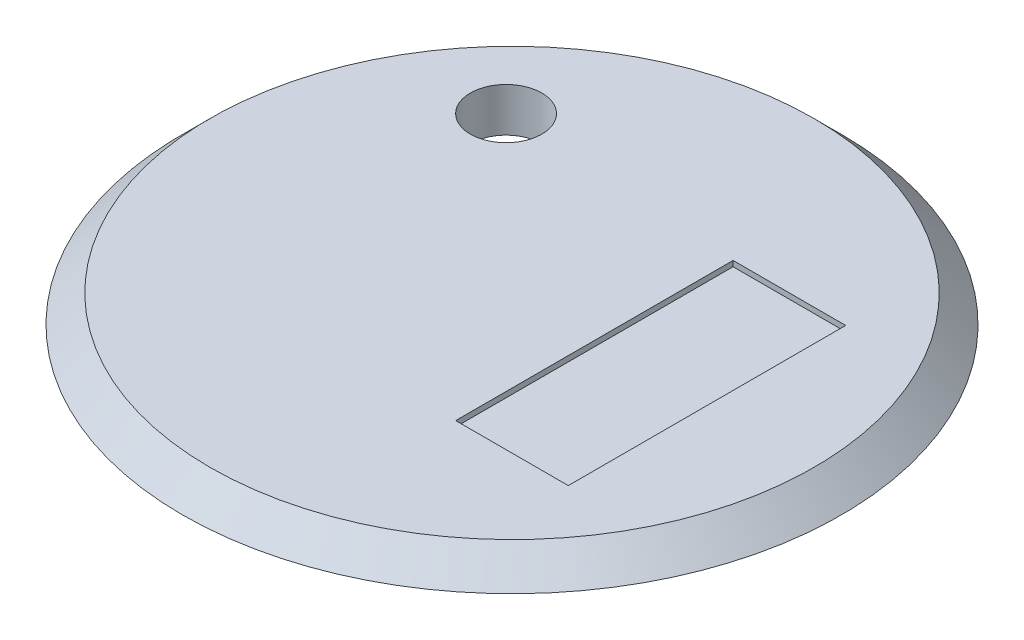
ISO-10303-21;
HEADER;
FILE_DESCRIPTION(('STEP AP214'),'2;1');
FILE_NAME('part.step','',(''),(''),'','','');
FILE_SCHEMA(('AUTOMOTIVE_DESIGN { 1 0 10303 214 1 1 1 1 }'));
ENDSEC;
DATA;
#1=APPLICATION_CONTEXT('core data for automotive mechanical design processes');
#2=APPLICATION_PROTOCOL_DEFINITION('international standard','automotive_design',2000,#1);
#3=PRODUCT_CONTEXT('',#1,'mechanical');
#4=PRODUCT('Part','Part','',(#3));
#5=PRODUCT_RELATED_PRODUCT_CATEGORY('part','',(#4));
#6=PRODUCT_DEFINITION_FORMATION('','',#4);
#7=PRODUCT_DEFINITION_CONTEXT('part definition',#1,'design');
#8=PRODUCT_DEFINITION('design','',#6,#7);
#9=PRODUCT_DEFINITION_SHAPE('','',#8);
#10=(LENGTH_UNIT() NAMED_UNIT(*) SI_UNIT(.MILLI.,.METRE.));
#11=(NAMED_UNIT(*) PLANE_ANGLE_UNIT() SI_UNIT($,.RADIAN.));
#12=(NAMED_UNIT(*) SI_UNIT($,.STERADIAN.) SOLID_ANGLE_UNIT());
#13=UNCERTAINTY_MEASURE_WITH_UNIT(LENGTH_MEASURE(1.E-05),#10,'distance_accuracy_value','');
#14=(GEOMETRIC_REPRESENTATION_CONTEXT(3) GLOBAL_UNCERTAINTY_ASSIGNED_CONTEXT((#13)) GLOBAL_UNIT_ASSIGNED_CONTEXT((#10,
#11,#12)) REPRESENTATION_CONTEXT('',''));
#15=CARTESIAN_POINT('',(0.,0.,0.));
#16=DIRECTION('',(0.,0.,1.));
#17=DIRECTION('',(1.,0.,0.));
#18=AXIS2_PLACEMENT_3D('',#15,#16,#17);
#19=CARTESIAN_POINT('',(0.,1.97,1.02348682681033E-13));
#20=DIRECTION('',(0.,1.,0.));
#21=DIRECTION('',(0.999926888300994,0.,-0.0120920656917045));
#22=AXIS2_PLACEMENT_3D('',#19,#20,#21);
#23=CYLINDRICAL_SURFACE('',#22,2.8325);
#24=CARTESIAN_POINT('',(0.,3.,1.02348685082632E-13));
#25=DIRECTION('',(0.,1.,0.));
#26=DIRECTION('',(0.999926888300994,0.,-0.0120920656917045));
#27=AXIS2_PLACEMENT_3D('',#24,#25,#26);
#28=CIRCLE('',#27,2.8325);
#29=CARTESIAN_POINT('',(2.83229291111252,3.,-0.0342507760716505));
#30=VERTEX_POINT('',#29);
#31=EDGE_CURVE('E245',#30,#30,#28,.T.);
#32=ORIENTED_EDGE('',*,*,#31,.F.);
#33=EDGE_LOOP('',(#32));
#34=FACE_BOUND('',#33,.T.);
#35=CARTESIAN_POINT('',(0.,2.97,1.02348682681033E-13));
#36=DIRECTION('',(0.,-1.,0.));
#37=DIRECTION('',(0.,0.,-1.));
#38=AXIS2_PLACEMENT_3D('',#35,#36,#37);
#39=CIRCLE('',#38,2.83250000000002);
#40=CARTESIAN_POINT('',(0.,2.97,-2.83249999999991));
#41=VERTEX_POINT('',#40);
#42=EDGE_CURVE('E236',#41,#41,#39,.T.);
#43=ORIENTED_EDGE('',*,*,#42,.F.);
#44=EDGE_LOOP('',(#43));
#45=FACE_BOUND('',#44,.T.);
#46=ADVANCED_FACE('F49',(#34,#45),#23,.T.);
#47=CARTESIAN_POINT('',(0.,-3.,0.));
#48=DIRECTION('',(0.,-1.,0.));
#49=DIRECTION('',(0.,0.,-1.));
#50=AXIS2_PLACEMENT_3D('',#47,#48,#49);
#51=PLANE('',#50);
#52=CARTESIAN_POINT('',(-28.8179520298445,-3.,-27.740325174835));
#53=DIRECTION('',(0.,-1.,0.));
#54=DIRECTION('',(0.,0.,-1.));
#55=AXIS2_PLACEMENT_3D('',#52,#53,#54);
#56=CIRCLE('',#55,6.5);
#57=CARTESIAN_POINT('',(-28.8179520298445,-3.,-34.240325174835));
#58=VERTEX_POINT('',#57);
#59=EDGE_CURVE('E217',#58,#58,#56,.T.);
#60=ORIENTED_EDGE('',*,*,#59,.F.);
#61=EDGE_LOOP('',(#60));
#62=FACE_BOUND('',#61,.T.);
#63=DIRECTION('',(-0.993415905480513,0.,-0.114563688568114));
#64=VECTOR('',#63,1.);
#65=CARTESIAN_POINT('',(-0.674538719980193,-3.,5.84912638259182));
#66=LINE('',#65,#64);
#67=CARTESIAN_POINT('',(-8.11561340448885,-3.,4.99099943086379));
#68=VERTEX_POINT('',#67);
#69=CARTESIAN_POINT('',(-24.4631082554801,-3.,3.10575751089279));
#70=VERTEX_POINT('',#69);
#71=EDGE_CURVE('E11',#68,#70,#66,.T.);
#72=ORIENTED_EDGE('',*,*,#71,.F.);
#73=CARTESIAN_POINT('',(0.,-3.,1.02348671092735E-13));
#74=DIRECTION('',(0.,-1.,0.));
#75=DIRECTION('',(0.,0.,-1.));
#76=AXIS2_PLACEMENT_3D('',#73,#74,#75);
#77=CIRCLE('',#76,9.5275);
#78=CARTESIAN_POINT('',(-4.79328517116161,-3.,8.23393426728222));
#79=VERTEX_POINT('',#78);
#80=EDGE_CURVE('E59',#68,#79,#77,.F.);
#81=ORIENTED_EDGE('',*,*,#80,.T.);
#82=DIRECTION('',(-0.138553330284402,0.,-0.990354974070965));
#83=VECTOR('',#82,1.);
#84=CARTESIAN_POINT('',(-5.83110394650622,-3.,0.815787159327242));
#85=LINE('',#84,#83);
#86=CARTESIAN_POINT('',(-2.513273505437,-3.,24.5310589156415));
#87=VERTEX_POINT('',#86);
#88=EDGE_CURVE('E437',#87,#79,#85,.T.);
#89=ORIENTED_EDGE('',*,*,#88,.F.);
#90=CARTESIAN_POINT('',(0.291906958619007,-3.,24.1386066076109));
#91=DIRECTION('',(0.,-1.,0.));
#92=DIRECTION('',(0.,0.,-1.));
#93=AXIS2_PLACEMENT_3D('',#90,#91,#92);
#94=CIRCLE('',#93,2.8325);
#95=CARTESIAN_POINT('',(3.10575751089256,-3.,24.4631082554801));
#96=VERTEX_POINT('',#95);
#97=EDGE_CURVE('E434',#96,#87,#94,.T.);
#98=ORIENTED_EDGE('',*,*,#97,.F.);
#99=DIRECTION('',(-0.114563688568118,0.,0.993415905480513));
#100=VECTOR('',#99,1.);
#101=CARTESIAN_POINT('',(5.84912638259167,-3.,0.674538719980198));
#102=LINE('',#101,#100);
#103=CARTESIAN_POINT('',(4.99099943086361,-3.,8.11561340448893));
#104=VERTEX_POINT('',#103);
#105=EDGE_CURVE('E431',#104,#96,#102,.T.);
#106=ORIENTED_EDGE('',*,*,#105,.F.);
#107=CARTESIAN_POINT('',(0.,-3.,1.02348671092735E-13));
#108=DIRECTION('',(0.,-1.,0.));
#109=DIRECTION('',(0.,0.,-1.));
#110=AXIS2_PLACEMENT_3D('',#107,#108,#109);
#111=CIRCLE('',#110,9.5275);
#112=CARTESIAN_POINT('',(8.23393426728209,-3.,4.79328517116164));
#113=VERTEX_POINT('',#112);
#114=EDGE_CURVE('E424',#104,#113,#111,.F.);
#115=ORIENTED_EDGE('',*,*,#114,.T.);
#116=DIRECTION('',(-0.990354974070964,0.,0.138553330284406));
#117=VECTOR('',#116,1.);
#118=CARTESIAN_POINT('',(0.815787159327267,-3.,5.83110394650625));
#119=LINE('',#118,#117);
#120=CARTESIAN_POINT('',(24.5310589156414,-3.,2.51327350543697));
#121=VERTEX_POINT('',#120);
#122=EDGE_CURVE('E421',#121,#113,#119,.T.);
#123=ORIENTED_EDGE('',*,*,#122,.F.);
#124=CARTESIAN_POINT('',(24.1386066076108,-3.,-0.291906958619036));
#125=DIRECTION('',(0.,-1.,0.));
#126=DIRECTION('',(0.,0.,-1.));
#127=AXIS2_PLACEMENT_3D('',#124,#125,#126);
#128=CIRCLE('',#127,2.8325);
#129=CARTESIAN_POINT('',(24.46310825548,-3.,-3.10575751089259));
#130=VERTEX_POINT('',#129);
#131=EDGE_CURVE('E418',#130,#121,#128,.T.);
#132=ORIENTED_EDGE('',*,*,#131,.F.);
#133=DIRECTION('',(0.993415905480513,0.,0.114563688568114));
#134=VECTOR('',#133,1.);
#135=CARTESIAN_POINT('',(0.674538719980169,-3.,-5.8491263825916));
#136=LINE('',#135,#134);
#137=CARTESIAN_POINT('',(8.11561340448876,-3.,-4.99099943086358));
#138=VERTEX_POINT('',#137);
#139=EDGE_CURVE('E415',#138,#130,#136,.T.);
#140=ORIENTED_EDGE('',*,*,#139,.F.);
#141=CARTESIAN_POINT('',(0.,-3.,1.02348671092735E-13));
#142=DIRECTION('',(0.,-1.,0.));
#143=DIRECTION('',(0.,0.,-1.));
#144=AXIS2_PLACEMENT_3D('',#141,#142,#143);
#145=CIRCLE('',#144,9.5275);
#146=CARTESIAN_POINT('',(4.79328517116157,-3.,-8.23393426728198));
#147=VERTEX_POINT('',#146);
#148=EDGE_CURVE('E408',#138,#147,#145,.F.);
#149=ORIENTED_EDGE('',*,*,#148,.T.);
#150=DIRECTION('',(0.138553330284395,0.,0.990354974070966));
#151=VECTOR('',#150,1.);
#152=CARTESIAN_POINT('',(5.8311039465061,-3.,-0.815787159327184));
#153=LINE('',#152,#151);
#154=CARTESIAN_POINT('',(2.51327350543708,-3.,-24.5310589156413));
#155=VERTEX_POINT('',#154);
#156=EDGE_CURVE('E401',#155,#147,#153,.T.);
#157=ORIENTED_EDGE('',*,*,#156,.F.);
#158=CARTESIAN_POINT('',(-0.291906958618932,-3.,-24.1386066076107));
#159=DIRECTION('',(0.,-1.,0.));
#160=DIRECTION('',(0.,0.,-1.));
#161=AXIS2_PLACEMENT_3D('',#158,#159,#160);
#162=CIRCLE('',#161,2.8325);
#163=CARTESIAN_POINT('',(-3.10575751089248,-3.,-24.46310825548));
#164=VERTEX_POINT('',#163);
#165=EDGE_CURVE('E398',#164,#155,#162,.T.);
#166=ORIENTED_EDGE('',*,*,#165,.F.);
#167=DIRECTION('',(0.114563688568125,0.,-0.993415905480512));
#168=VECTOR('',#167,1.);
#169=CARTESIAN_POINT('',(-5.84912638259174,-3.,-0.674538719980246));
#170=LINE('',#169,#168);
#171=CARTESIAN_POINT('',(-4.99099943086365,-3.,-8.11561340448876));
#172=VERTEX_POINT('',#171);
#173=EDGE_CURVE('E395',#172,#164,#170,.T.);
#174=ORIENTED_EDGE('',*,*,#173,.F.);
#175=CARTESIAN_POINT('',(0.,-3.,1.02348671092735E-13));
#176=DIRECTION('',(0.,-1.,0.));
#177=DIRECTION('',(0.,0.,-1.));
#178=AXIS2_PLACEMENT_3D('',#175,#176,#177);
#179=CIRCLE('',#178,9.5275);
#180=CARTESIAN_POINT('',(-8.23393426728218,-3.,-4.79328517116143));
#181=VERTEX_POINT('',#180);
#182=EDGE_CURVE('E404',#172,#181,#179,.F.);
#183=ORIENTED_EDGE('',*,*,#182,.T.);
#184=DIRECTION('',(0.990354974070964,0.,-0.138553330284406));
#185=VECTOR('',#184,1.);
#186=CARTESIAN_POINT('',(-0.815787159327241,-3.,-5.83110394650606));
#187=LINE('',#186,#185);
#188=CARTESIAN_POINT('',(-24.5310589156415,-3.,-2.51327350543676));
#189=VERTEX_POINT('',#188);
#190=EDGE_CURVE('E412',#189,#181,#187,.T.);
#191=ORIENTED_EDGE('',*,*,#190,.F.);
#192=CARTESIAN_POINT('',(-24.1386066076109,-3.,0.29190695861924));
#193=DIRECTION('',(0.,-1.,0.));
#194=DIRECTION('',(0.,0.,-1.));
#195=AXIS2_PLACEMENT_3D('',#192,#193,#194);
#196=CIRCLE('',#195,2.8325);
#197=EDGE_CURVE('E428',#70,#189,#196,.T.);
#198=ORIENTED_EDGE('',*,*,#197,.F.);
#199=EDGE_LOOP('',(#72,#81,#89,#98,#106,#115,#123,#132,#140,#149,#157,#166,#174,#183,#191,#198));
#200=FACE_BOUND('',#199,.T.);
#201=CARTESIAN_POINT('',(0.,-3.,0.));
#202=DIRECTION('',(0.,-1.,0.));
#203=DIRECTION('',(0.,0.,-1.));
#204=AXIS2_PLACEMENT_3D('',#201,#202,#203);
#205=CIRCLE('',#204,49.5);
#206=CARTESIAN_POINT('',(0.,-3.,-49.5));
#207=VERTEX_POINT('',#206);
#208=EDGE_CURVE('E379',#207,#207,#205,.T.);
#209=ORIENTED_EDGE('',*,*,#208,.T.);
#210=EDGE_LOOP('',(#209));
#211=FACE_BOUND('',#210,.T.);
#212=ADVANCED_FACE('F444',(#62,#200,#211),#51,.T.);
#213=CARTESIAN_POINT('',(0.,5.,0.));
#214=DIRECTION('',(0.,1.,0.));
#215=DIRECTION('',(0.,0.,1.));
#216=AXIS2_PLACEMENT_3D('',#213,#214,#215);
#217=PLANE('',#216);
#218=CARTESIAN_POINT('',(-28.8179520298445,5.,-27.740325174835));
#219=DIRECTION('',(0.,-1.,0.));
#220=DIRECTION('',(0.,0.,-1.));
#221=AXIS2_PLACEMENT_3D('',#218,#219,#220);
#222=CIRCLE('',#221,6.5);
#223=CARTESIAN_POINT('',(-28.8179520298445,5.,-34.240325174835));
#224=VERTEX_POINT('',#223);
#225=EDGE_CURVE('E227',#224,#224,#222,.T.);
#226=ORIENTED_EDGE('',*,*,#225,.T.);
#227=EDGE_LOOP('',(#226));
#228=FACE_BOUND('',#227,.T.);
#229=DIRECTION('',(-1.,0.,0.));
#230=VECTOR('',#229,1.);
#231=CARTESIAN_POINT('',(35.5,5.,-25.25));
#232=LINE('',#231,#230);
#233=CARTESIAN_POINT('',(35.5,5.,-25.25));
#234=VERTEX_POINT('',#233);
#235=CARTESIAN_POINT('',(15.,5.,-25.25));
#236=VERTEX_POINT('',#235);
#237=EDGE_CURVE('E66',#234,#236,#232,.T.);
#238=ORIENTED_EDGE('',*,*,#237,.F.);
#239=DIRECTION('',(0.,0.,-1.));
#240=VECTOR('',#239,1.);
#241=CARTESIAN_POINT('',(35.5,5.,25.25));
#242=LINE('',#241,#240);
#243=CARTESIAN_POINT('',(35.5,5.,25.25));
#244=VERTEX_POINT('',#243);
#245=EDGE_CURVE('E210',#244,#234,#242,.T.);
#246=ORIENTED_EDGE('',*,*,#245,.F.);
#247=DIRECTION('',(1.,0.,0.));
#248=VECTOR('',#247,1.);
#249=CARTESIAN_POINT('',(15.,5.,25.25));
#250=LINE('',#249,#248);
#251=CARTESIAN_POINT('',(15.,5.,25.25));
#252=VERTEX_POINT('',#251);
#253=EDGE_CURVE('E214',#252,#244,#250,.T.);
#254=ORIENTED_EDGE('',*,*,#253,.F.);
#255=DIRECTION('',(0.,0.,1.));
#256=VECTOR('',#255,1.);
#257=CARTESIAN_POINT('',(15.,5.,-25.25));
#258=LINE('',#257,#256);
#259=EDGE_CURVE('E226',#236,#252,#258,.T.);
#260=ORIENTED_EDGE('',*,*,#259,.F.);
#261=EDGE_LOOP('',(#238,#246,#254,#260));
#262=FACE_BOUND('',#261,.T.);
#263=CARTESIAN_POINT('',(0.,5.,0.));
#264=DIRECTION('',(0.,1.,0.));
#265=DIRECTION('',(0.,0.,1.));
#266=AXIS2_PLACEMENT_3D('',#263,#264,#265);
#267=CIRCLE('',#266,55.0000000000001);
#268=CARTESIAN_POINT('',(0.,5.,55.0000000000001));
#269=VERTEX_POINT('',#268);
#270=EDGE_CURVE('E388',#269,#269,#267,.T.);
#271=ORIENTED_EDGE('',*,*,#270,.T.);
#272=EDGE_LOOP('',(#271));
#273=FACE_BOUND('',#272,.T.);
#274=ADVANCED_FACE('F522',(#228,#262,#273),#217,.T.);
#275=CARTESIAN_POINT('',(0.,0.,0.));
#276=DIRECTION('',(0.,1.,0.));
#277=DIRECTION('',(0.,0.,1.));
#278=AXIS2_PLACEMENT_3D('',#275,#276,#277);
#279=PLANE('',#278);
#280=CARTESIAN_POINT('',(0.,0.,0.));
#281=DIRECTION('',(0.,-1.,0.));
#282=DIRECTION('',(0.,0.,-1.));
#283=AXIS2_PLACEMENT_3D('',#280,#281,#282);
#284=CIRCLE('',#283,49.5);
#285=CARTESIAN_POINT('',(0.,0.,-49.5));
#286=VERTEX_POINT('',#285);
#287=EDGE_CURVE('E384',#286,#286,#284,.T.);
#288=ORIENTED_EDGE('',*,*,#287,.F.);
#289=EDGE_LOOP('',(#288));
#290=FACE_BOUND('',#289,.T.);
#291=CARTESIAN_POINT('',(0.,0.,0.));
#292=DIRECTION('',(0.,1.,0.));
#293=DIRECTION('',(0.,0.,1.));
#294=AXIS2_PLACEMENT_3D('',#291,#292,#293);
#295=CIRCLE('',#294,60.);
#296=CARTESIAN_POINT('',(0.,0.,60.));
#297=VERTEX_POINT('',#296);
#298=EDGE_CURVE('E383',#297,#297,#295,.T.);
#299=ORIENTED_EDGE('',*,*,#298,.F.);
#300=EDGE_LOOP('',(#299));
#301=FACE_BOUND('',#300,.T.);
#302=ADVANCED_FACE('F560',(#290,#301),#279,.F.);
#303=CARTESIAN_POINT('',(0.,-3.,0.));
#304=DIRECTION('',(0.,1.,0.));
#305=DIRECTION('',(0.,0.,1.));
#306=AXIS2_PLACEMENT_3D('',#303,#304,#305);
#307=CYLINDRICAL_SURFACE('',#306,49.5);
#308=ORIENTED_EDGE('',*,*,#208,.F.);
#309=EDGE_LOOP('',(#308));
#310=FACE_BOUND('',#309,.T.);
#311=ORIENTED_EDGE('',*,*,#287,.T.);
#312=EDGE_LOOP('',(#311));
#313=FACE_BOUND('',#312,.T.);
#314=ADVANCED_FACE('F557',(#310,#313),#307,.T.);
#315=CARTESIAN_POINT('',(0.,5.,0.));
#316=DIRECTION('',(0.,-1.,0.));
#317=DIRECTION('',(0.,0.,-1.));
#318=AXIS2_PLACEMENT_3D('',#315,#316,#317);
#319=CONICAL_SURFACE('',#318,55.0000000000001,0.785398163397443);
#320=ORIENTED_EDGE('',*,*,#298,.T.);
#321=EDGE_LOOP('',(#320));
#322=FACE_BOUND('',#321,.T.);
#323=ORIENTED_EDGE('',*,*,#270,.F.);
#324=EDGE_LOOP('',(#323));
#325=FACE_BOUND('',#324,.T.);
#326=ADVANCED_FACE('F52',(#322,#325),#319,.T.);
#327=CARTESIAN_POINT('',(0.,-5.24,1.0234866586984E-13));
#328=DIRECTION('',(0.,1.,0.));
#329=DIRECTION('',(0.999926888300994,0.,-0.0120920656917045));
#330=AXIS2_PLACEMENT_3D('',#327,#328,#329);
#331=CYLINDRICAL_SURFACE('',#330,9.5275);
#332=DIRECTION('',(0.,-1.,0.));
#333=VECTOR('',#332,1.);
#334=CARTESIAN_POINT('',(8.11561340448876,24.1917963195667,-4.99099943086358));
#335=LINE('',#334,#333);
#336=CARTESIAN_POINT('',(8.11561340448876,1.97,-4.99099943086358));
#337=VERTEX_POINT('',#336);
#338=EDGE_CURVE('E348',#337,#138,#335,.T.);
#339=ORIENTED_EDGE('',*,*,#338,.F.);
#340=CARTESIAN_POINT('',(0.,1.97,1.02348682681033E-13));
#341=DIRECTION('',(0.,1.,0.));
#342=DIRECTION('',(0.999926888300994,0.,-0.0120920656917045));
#343=AXIS2_PLACEMENT_3D('',#340,#341,#342);
#344=CIRCLE('',#343,9.5275);
#345=CARTESIAN_POINT('',(4.79328517116157,1.97,-8.23393426728198));
#346=VERTEX_POINT('',#345);
#347=EDGE_CURVE('E268',#337,#346,#344,.T.);
#348=ORIENTED_EDGE('',*,*,#347,.T.);
#349=DIRECTION('',(0.,-1.,0.));
#350=VECTOR('',#349,1.);
#351=CARTESIAN_POINT('',(4.79328517116157,24.1917963195667,-8.23393426728198));
#352=LINE('',#351,#350);
#353=EDGE_CURVE('E313',#346,#147,#352,.T.);
#354=ORIENTED_EDGE('',*,*,#353,.T.);
#355=ORIENTED_EDGE('',*,*,#148,.F.);
#356=EDGE_LOOP('',(#339,#348,#354,#355));
#357=FACE_BOUND('',#356,.T.);
#358=ADVANCED_FACE('F486',(#357),#331,.F.);
#359=DIRECTION('',(0.,-1.,0.));
#360=VECTOR('',#359,1.);
#361=CARTESIAN_POINT('',(-4.99099943086365,24.1917963195667,-8.11561340448876));
#362=LINE('',#361,#360);
#363=CARTESIAN_POINT('',(-4.99099943086365,1.97,-8.11561340448876));
#364=VERTEX_POINT('',#363);
#365=EDGE_CURVE('E74',#364,#172,#362,.T.);
#366=ORIENTED_EDGE('',*,*,#365,.F.);
#367=CARTESIAN_POINT('',(0.,1.97,1.02348682681033E-13));
#368=DIRECTION('',(0.,1.,0.));
#369=DIRECTION('',(0.999926888300994,0.,-0.0120920656917045));
#370=AXIS2_PLACEMENT_3D('',#367,#368,#369);
#371=CIRCLE('',#370,9.5275);
#372=CARTESIAN_POINT('',(-8.23393426728218,1.97,-4.79328517116143));
#373=VERTEX_POINT('',#372);
#374=EDGE_CURVE('E265',#364,#373,#371,.T.);
#375=ORIENTED_EDGE('',*,*,#374,.T.);
#376=DIRECTION('',(0.,-1.,0.));
#377=VECTOR('',#376,1.);
#378=CARTESIAN_POINT('',(-8.23393426728218,24.1917963195667,-4.79328517116143));
#379=LINE('',#378,#377);
#380=EDGE_CURVE('E328',#373,#181,#379,.T.);
#381=ORIENTED_EDGE('',*,*,#380,.T.);
#382=ORIENTED_EDGE('',*,*,#182,.F.);
#383=EDGE_LOOP('',(#366,#375,#381,#382));
#384=FACE_BOUND('',#383,.T.);
#385=ADVANCED_FACE('F501',(#384),#331,.F.);
#386=DIRECTION('',(0.,-1.,0.));
#387=VECTOR('',#386,1.);
#388=CARTESIAN_POINT('',(-8.11561340448885,24.1917963195667,4.99099943086379));
#389=LINE('',#388,#387);
#390=CARTESIAN_POINT('',(-8.11561340448885,1.97,4.99099943086379));
#391=VERTEX_POINT('',#390);
#392=EDGE_CURVE('E317',#391,#68,#389,.T.);
#393=ORIENTED_EDGE('',*,*,#392,.F.);
#394=CARTESIAN_POINT('',(0.,1.97,1.02348682681033E-13));
#395=DIRECTION('',(0.,1.,0.));
#396=DIRECTION('',(0.999926888300994,0.,-0.0120920656917045));
#397=AXIS2_PLACEMENT_3D('',#394,#395,#396);
#398=CIRCLE('',#397,9.5275);
#399=CARTESIAN_POINT('',(-4.79328517116161,1.97,8.23393426728222));
#400=VERTEX_POINT('',#399);
#401=EDGE_CURVE('E306',#391,#400,#398,.T.);
#402=ORIENTED_EDGE('',*,*,#401,.T.);
#403=DIRECTION('',(0.,-1.,0.));
#404=VECTOR('',#403,1.);
#405=CARTESIAN_POINT('',(-4.79328517116161,24.1917963195667,8.23393426728222));
#406=LINE('',#405,#404);
#407=EDGE_CURVE('E344',#400,#79,#406,.T.);
#408=ORIENTED_EDGE('',*,*,#407,.T.);
#409=ORIENTED_EDGE('',*,*,#80,.F.);
#410=EDGE_LOOP('',(#393,#402,#408,#409));
#411=FACE_BOUND('',#410,.T.);
#412=ADVANCED_FACE('F450',(#411),#331,.F.);
#413=DIRECTION('',(0.,-1.,0.));
#414=VECTOR('',#413,1.);
#415=CARTESIAN_POINT('',(4.99099943086361,24.1917963195667,8.11561340448893));
#416=LINE('',#415,#414);
#417=CARTESIAN_POINT('',(4.99099943086361,1.97,8.11561340448893));
#418=VERTEX_POINT('',#417);
#419=EDGE_CURVE('E332',#418,#104,#416,.T.);
#420=ORIENTED_EDGE('',*,*,#419,.F.);
#421=CARTESIAN_POINT('',(0.,1.97,1.02348682681033E-13));
#422=DIRECTION('',(0.,1.,0.));
#423=DIRECTION('',(0.999926888300994,0.,-0.0120920656917045));
#424=AXIS2_PLACEMENT_3D('',#421,#422,#423);
#425=CIRCLE('',#424,9.5275);
#426=CARTESIAN_POINT('',(8.23393426728209,1.97,4.79328517116164));
#427=VERTEX_POINT('',#426);
#428=EDGE_CURVE('E287',#418,#427,#425,.T.);
#429=ORIENTED_EDGE('',*,*,#428,.T.);
#430=DIRECTION('',(0.,-1.,0.));
#431=VECTOR('',#430,1.);
#432=CARTESIAN_POINT('',(8.23393426728209,24.1917963195667,4.79328517116164));
#433=LINE('',#432,#431);
#434=EDGE_CURVE('E360',#427,#113,#433,.T.);
#435=ORIENTED_EDGE('',*,*,#434,.T.);
#436=ORIENTED_EDGE('',*,*,#114,.F.);
#437=EDGE_LOOP('',(#420,#429,#435,#436));
#438=FACE_BOUND('',#437,.T.);
#439=ADVANCED_FACE('F471',(#438),#331,.F.);
#440=CARTESIAN_POINT('',(8.23393426728209,24.1917963195667,4.79328517116164));
#441=DIRECTION('',(0.138553330284406,0.,0.990354974070965));
#442=DIRECTION('',(-0.990354974070965,0.,0.138553330284406));
#443=AXIS2_PLACEMENT_3D('',#440,#441,#442);
#444=PLANE('',#443);
#445=ORIENTED_EDGE('',*,*,#122,.T.);
#446=ORIENTED_EDGE('',*,*,#434,.F.);
#447=DIRECTION('',(-0.990354974070965,0.,0.138553330284406));
#448=VECTOR('',#447,1.);
#449=CARTESIAN_POINT('',(8.23393426728209,1.97,4.79328517116164));
#450=LINE('',#449,#448);
#451=CARTESIAN_POINT('',(24.5310589156414,1.97,2.51327350543697));
#452=VERTEX_POINT('',#451);
#453=EDGE_CURVE('E283',#452,#427,#450,.T.);
#454=ORIENTED_EDGE('',*,*,#453,.F.);
#455=DIRECTION('',(0.,-1.,0.));
#456=VECTOR('',#455,1.);
#457=CARTESIAN_POINT('',(24.5310589156414,24.1917963195667,2.51327350543697));
#458=LINE('',#457,#456);
#459=EDGE_CURVE('E365',#452,#121,#458,.T.);
#460=ORIENTED_EDGE('',*,*,#459,.T.);
#461=EDGE_LOOP('',(#445,#446,#454,#460));
#462=FACE_BOUND('',#461,.T.);
#463=ADVANCED_FACE('F474',(#462),#444,.F.);
#464=CARTESIAN_POINT('',(24.1386066076108,24.1917963195667,-0.291906958619036));
#465=DIRECTION('',(0.,-1.,0.));
#466=DIRECTION('',(-0.999926888300994,0.,0.0120920656917045));
#467=AXIS2_PLACEMENT_3D('',#464,#465,#466);
#468=CYLINDRICAL_SURFACE('',#467,2.8325);
#469=ORIENTED_EDGE('',*,*,#131,.T.);
#470=ORIENTED_EDGE('',*,*,#459,.F.);
#471=CARTESIAN_POINT('',(24.1386066076108,1.97,-0.291906958619036));
#472=DIRECTION('',(0.,1.,0.));
#473=DIRECTION('',(0.999926888300994,0.,-0.0120920656917045));
#474=AXIS2_PLACEMENT_3D('',#471,#472,#473);
#475=CIRCLE('',#474,2.8325);
#476=CARTESIAN_POINT('',(24.46310825548,1.97,-3.10575751089259));
#477=VERTEX_POINT('',#476);
#478=EDGE_CURVE('E279',#477,#452,#475,.F.);
#479=ORIENTED_EDGE('',*,*,#478,.F.);
#480=DIRECTION('',(0.,-1.,0.));
#481=VECTOR('',#480,1.);
#482=CARTESIAN_POINT('',(24.46310825548,24.1917963195667,-3.10575751089259));
#483=LINE('',#482,#481);
#484=EDGE_CURVE('E369',#477,#130,#483,.T.);
#485=ORIENTED_EDGE('',*,*,#484,.T.);
#486=EDGE_LOOP('',(#469,#470,#479,#485));
#487=FACE_BOUND('',#486,.T.);
#488=ADVANCED_FACE('F479',(#487),#468,.F.);
#489=CARTESIAN_POINT('',(24.46310825548,24.1917963195667,-3.10575751089259));
#490=DIRECTION('',(0.114563688568114,0.,-0.993415905480514));
#491=DIRECTION('',(0.993415905480514,0.,0.114563688568114));
#492=AXIS2_PLACEMENT_3D('',#489,#490,#491);
#493=PLANE('',#492);
#494=ORIENTED_EDGE('',*,*,#139,.T.);
#495=ORIENTED_EDGE('',*,*,#484,.F.);
#496=DIRECTION('',(0.993415905480514,0.,0.114563688568114));
#497=VECTOR('',#496,1.);
#498=CARTESIAN_POINT('',(24.46310825548,1.97,-3.10575751089259));
#499=LINE('',#498,#497);
#500=EDGE_CURVE('E275',#337,#477,#499,.T.);
#501=ORIENTED_EDGE('',*,*,#500,.F.);
#502=ORIENTED_EDGE('',*,*,#338,.T.);
#503=EDGE_LOOP('',(#494,#495,#501,#502));
#504=FACE_BOUND('',#503,.T.);
#505=ADVANCED_FACE('F482',(#504),#493,.F.);
#506=CARTESIAN_POINT('',(-4.79328517116161,24.1917963195667,8.23393426728222));
#507=DIRECTION('',(-0.990354974070965,0.,0.138553330284402));
#508=DIRECTION('',(-0.138553330284402,0.,-0.990354974070965));
#509=AXIS2_PLACEMENT_3D('',#506,#507,#508);
#510=PLANE('',#509);
#511=ORIENTED_EDGE('',*,*,#88,.T.);
#512=ORIENTED_EDGE('',*,*,#407,.F.);
#513=DIRECTION('',(-0.138553330284402,0.,-0.990354974070965));
#514=VECTOR('',#513,1.);
#515=CARTESIAN_POINT('',(-4.79328517116161,1.97,8.23393426728222));
#516=LINE('',#515,#514);
#517=CARTESIAN_POINT('',(-2.513273505437,1.97,24.5310589156415));
#518=VERTEX_POINT('',#517);
#519=EDGE_CURVE('E302',#518,#400,#516,.T.);
#520=ORIENTED_EDGE('',*,*,#519,.F.);
#521=DIRECTION('',(0.,-1.,0.));
#522=VECTOR('',#521,1.);
#523=CARTESIAN_POINT('',(-2.513273505437,24.1917963195667,24.5310589156415));
#524=LINE('',#523,#522);
#525=EDGE_CURVE('E349',#518,#87,#524,.T.);
#526=ORIENTED_EDGE('',*,*,#525,.T.);
#527=EDGE_LOOP('',(#511,#512,#520,#526));
#528=FACE_BOUND('',#527,.T.);
#529=ADVANCED_FACE('F460',(#528),#510,.F.);
#530=CARTESIAN_POINT('',(0.291906958619007,24.1917963195667,24.1386066076109));
#531=DIRECTION('',(0.,-1.,0.));
#532=DIRECTION('',(-0.999926888300994,0.,0.0120920656917045));
#533=AXIS2_PLACEMENT_3D('',#530,#531,#532);
#534=CYLINDRICAL_SURFACE('',#533,2.8325);
#535=ORIENTED_EDGE('',*,*,#97,.T.);
#536=ORIENTED_EDGE('',*,*,#525,.F.);
#537=CARTESIAN_POINT('',(0.291906958619007,1.97,24.1386066076109));
#538=DIRECTION('',(0.,1.,0.));
#539=DIRECTION('',(0.999926888300994,0.,-0.0120920656917045));
#540=AXIS2_PLACEMENT_3D('',#537,#538,#539);
#541=CIRCLE('',#540,2.8325);
#542=CARTESIAN_POINT('',(3.10575751089256,1.97,24.4631082554801));
#543=VERTEX_POINT('',#542);
#544=EDGE_CURVE('E298',#543,#518,#541,.F.);
#545=ORIENTED_EDGE('',*,*,#544,.F.);
#546=DIRECTION('',(0.,-1.,0.));
#547=VECTOR('',#546,1.);
#548=CARTESIAN_POINT('',(3.10575751089256,24.1917963195667,24.4631082554801));
#549=LINE('',#548,#547);
#550=EDGE_CURVE('E353',#543,#96,#549,.T.);
#551=ORIENTED_EDGE('',*,*,#550,.T.);
#552=EDGE_LOOP('',(#535,#536,#545,#551));
#553=FACE_BOUND('',#552,.T.);
#554=ADVANCED_FACE('F462',(#553),#534,.F.);
#555=CARTESIAN_POINT('',(3.10575751089256,24.1917963195667,24.4631082554801));
#556=DIRECTION('',(0.993415905480513,0.,0.114563688568118));
#557=DIRECTION('',(-0.114563688568118,0.,0.993415905480513));
#558=AXIS2_PLACEMENT_3D('',#555,#556,#557);
#559=PLANE('',#558);
#560=ORIENTED_EDGE('',*,*,#105,.T.);
#561=ORIENTED_EDGE('',*,*,#550,.F.);
#562=DIRECTION('',(-0.114563688568118,0.,0.993415905480513));
#563=VECTOR('',#562,1.);
#564=CARTESIAN_POINT('',(3.10575751089256,1.97,24.4631082554801));
#565=LINE('',#564,#563);
#566=EDGE_CURVE('E294',#418,#543,#565,.T.);
#567=ORIENTED_EDGE('',*,*,#566,.F.);
#568=ORIENTED_EDGE('',*,*,#419,.T.);
#569=EDGE_LOOP('',(#560,#561,#567,#568));
#570=FACE_BOUND('',#569,.T.);
#571=ADVANCED_FACE('F467',(#570),#559,.F.);
#572=CARTESIAN_POINT('',(-8.23393426728218,24.1917963195667,-4.79328517116143));
#573=DIRECTION('',(-0.138553330284406,0.,-0.990354974070965));
#574=DIRECTION('',(0.990354974070965,0.,-0.138553330284406));
#575=AXIS2_PLACEMENT_3D('',#572,#573,#574);
#576=PLANE('',#575);
#577=ORIENTED_EDGE('',*,*,#190,.T.);
#578=ORIENTED_EDGE('',*,*,#380,.F.);
#579=DIRECTION('',(0.990354974070965,0.,-0.138553330284406));
#580=VECTOR('',#579,1.);
#581=CARTESIAN_POINT('',(-8.23393426728218,1.97,-4.79328517116143));
#582=LINE('',#581,#580);
#583=CARTESIAN_POINT('',(-24.5310589156415,1.97,-2.51327350543676));
#584=VERTEX_POINT('',#583);
#585=EDGE_CURVE('E271',#584,#373,#582,.T.);
#586=ORIENTED_EDGE('',*,*,#585,.F.);
#587=DIRECTION('',(0.,-1.,0.));
#588=VECTOR('',#587,1.);
#589=CARTESIAN_POINT('',(-24.5310589156415,24.1917963195667,-2.51327350543676));
#590=LINE('',#589,#588);
#591=EDGE_CURVE('E333',#584,#189,#590,.T.);
#592=ORIENTED_EDGE('',*,*,#591,.T.);
#593=EDGE_LOOP('',(#577,#578,#586,#592));
#594=FACE_BOUND('',#593,.T.);
#595=ADVANCED_FACE('F504',(#594),#576,.F.);
#596=CARTESIAN_POINT('',(-24.1386066076109,24.1917963195667,0.29190695861924));
#597=DIRECTION('',(0.,-1.,0.));
#598=DIRECTION('',(-0.999926888300994,0.,0.0120920656917045));
#599=AXIS2_PLACEMENT_3D('',#596,#597,#598);
#600=CYLINDRICAL_SURFACE('',#599,2.8325);
#601=ORIENTED_EDGE('',*,*,#197,.T.);
#602=ORIENTED_EDGE('',*,*,#591,.F.);
#603=CARTESIAN_POINT('',(-24.1386066076109,1.97,0.29190695861924));
#604=DIRECTION('',(0.,1.,0.));
#605=DIRECTION('',(0.999926888300994,0.,-0.0120920656917045));
#606=AXIS2_PLACEMENT_3D('',#603,#604,#605);
#607=CIRCLE('',#606,2.8325);
#608=CARTESIAN_POINT('',(-24.4631082554801,1.97,3.10575751089279));
#609=VERTEX_POINT('',#608);
#610=EDGE_CURVE('E290',#609,#584,#607,.F.);
#611=ORIENTED_EDGE('',*,*,#610,.F.);
#612=DIRECTION('',(0.,-1.,0.));
#613=VECTOR('',#612,1.);
#614=CARTESIAN_POINT('',(-24.4631082554801,24.1917963195667,3.10575751089279));
#615=LINE('',#614,#613);
#616=EDGE_CURVE('E337',#609,#70,#615,.T.);
#617=ORIENTED_EDGE('',*,*,#616,.T.);
#618=EDGE_LOOP('',(#601,#602,#611,#617));
#619=FACE_BOUND('',#618,.T.);
#620=ADVANCED_FACE('F507',(#619),#600,.F.);
#621=CARTESIAN_POINT('',(-24.4631082554801,24.1917963195667,3.10575751089279));
#622=DIRECTION('',(-0.114563688568114,0.,0.993415905480514));
#623=DIRECTION('',(-0.993415905480514,0.,-0.114563688568114));
#624=AXIS2_PLACEMENT_3D('',#621,#622,#623);
#625=PLANE('',#624);
#626=ORIENTED_EDGE('',*,*,#71,.T.);
#627=ORIENTED_EDGE('',*,*,#616,.F.);
#628=DIRECTION('',(-0.993415905480514,0.,-0.114563688568114));
#629=VECTOR('',#628,1.);
#630=CARTESIAN_POINT('',(-24.4631082554801,1.97,3.10575751089279));
#631=LINE('',#630,#629);
#632=EDGE_CURVE('E309',#391,#609,#631,.T.);
#633=ORIENTED_EDGE('',*,*,#632,.F.);
#634=ORIENTED_EDGE('',*,*,#392,.T.);
#635=EDGE_LOOP('',(#626,#627,#633,#634));
#636=FACE_BOUND('',#635,.T.);
#637=ADVANCED_FACE('F453',(#636),#625,.F.);
#638=CARTESIAN_POINT('',(4.79328517116157,24.1917963195667,-8.23393426728198));
#639=DIRECTION('',(0.990354974070966,0.,-0.138553330284395));
#640=DIRECTION('',(0.138553330284395,0.,0.990354974070966));
#641=AXIS2_PLACEMENT_3D('',#638,#639,#640);
#642=PLANE('',#641);
#643=ORIENTED_EDGE('',*,*,#156,.T.);
#644=ORIENTED_EDGE('',*,*,#353,.F.);
#645=DIRECTION('',(0.138553330284395,0.,0.990354974070966));
#646=VECTOR('',#645,1.);
#647=CARTESIAN_POINT('',(4.79328517116157,1.97,-8.23393426728198));
#648=LINE('',#647,#646);
#649=CARTESIAN_POINT('',(2.51327350543708,1.97,-24.5310589156413));
#650=VERTEX_POINT('',#649);
#651=EDGE_CURVE('E261',#650,#346,#648,.T.);
#652=ORIENTED_EDGE('',*,*,#651,.F.);
#653=DIRECTION('',(0.,-1.,0.));
#654=VECTOR('',#653,1.);
#655=CARTESIAN_POINT('',(2.51327350543708,24.1917963195667,-24.5310589156413));
#656=LINE('',#655,#654);
#657=EDGE_CURVE('E318',#650,#155,#656,.T.);
#658=ORIENTED_EDGE('',*,*,#657,.T.);
#659=EDGE_LOOP('',(#643,#644,#652,#658));
#660=FACE_BOUND('',#659,.T.);
#661=ADVANCED_FACE('F492',(#660),#642,.F.);
#662=CARTESIAN_POINT('',(-0.291906958618932,24.1917963195667,-24.1386066076107));
#663=DIRECTION('',(0.,-1.,0.));
#664=DIRECTION('',(-0.999926888300994,0.,0.0120920656917045));
#665=AXIS2_PLACEMENT_3D('',#662,#663,#664);
#666=CYLINDRICAL_SURFACE('',#665,2.8325);
#667=ORIENTED_EDGE('',*,*,#165,.T.);
#668=ORIENTED_EDGE('',*,*,#657,.F.);
#669=CARTESIAN_POINT('',(-0.291906958618932,1.97,-24.1386066076107));
#670=DIRECTION('',(0.,1.,0.));
#671=DIRECTION('',(0.999926888300994,0.,-0.0120920656917045));
#672=AXIS2_PLACEMENT_3D('',#669,#670,#671);
#673=CIRCLE('',#672,2.8325);
#674=CARTESIAN_POINT('',(-3.10575751089248,1.97,-24.46310825548));
#675=VERTEX_POINT('',#674);
#676=EDGE_CURVE('E257',#675,#650,#673,.F.);
#677=ORIENTED_EDGE('',*,*,#676,.F.);
#678=DIRECTION('',(0.,-1.,0.));
#679=VECTOR('',#678,1.);
#680=CARTESIAN_POINT('',(-3.10575751089248,24.1917963195667,-24.46310825548));
#681=LINE('',#680,#679);
#682=EDGE_CURVE('E322',#675,#164,#681,.T.);
#683=ORIENTED_EDGE('',*,*,#682,.T.);
#684=EDGE_LOOP('',(#667,#668,#677,#683));
#685=FACE_BOUND('',#684,.T.);
#686=ADVANCED_FACE('F495',(#685),#666,.F.);
#687=CARTESIAN_POINT('',(-3.10575751089248,24.1917963195667,-24.46310825548));
#688=DIRECTION('',(-0.993415905480512,0.,-0.114563688568125));
#689=DIRECTION('',(0.114563688568125,0.,-0.993415905480512));
#690=AXIS2_PLACEMENT_3D('',#687,#688,#689);
#691=PLANE('',#690);
#692=ORIENTED_EDGE('',*,*,#173,.T.);
#693=ORIENTED_EDGE('',*,*,#682,.F.);
#694=DIRECTION('',(0.114563688568125,0.,-0.993415905480512));
#695=VECTOR('',#694,1.);
#696=CARTESIAN_POINT('',(-3.10575751089248,1.97,-24.46310825548));
#697=LINE('',#696,#695);
#698=EDGE_CURVE('E253',#364,#675,#697,.T.);
#699=ORIENTED_EDGE('',*,*,#698,.F.);
#700=ORIENTED_EDGE('',*,*,#365,.T.);
#701=EDGE_LOOP('',(#692,#693,#699,#700));
#702=FACE_BOUND('',#701,.T.);
#703=ADVANCED_FACE('F497',(#702),#691,.F.);
#704=CARTESIAN_POINT('',(0.,3.,1.02348685082632E-13));
#705=DIRECTION('',(0.,-1.,0.));
#706=DIRECTION('',(-0.999926888300994,0.,0.0120920656917045));
#707=AXIS2_PLACEMENT_3D('',#704,#705,#706);
#708=PLANE('',#707);
#709=ORIENTED_EDGE('',*,*,#31,.T.);
#710=EDGE_LOOP('',(#709));
#711=FACE_BOUND('',#710,.T.);
#712=CARTESIAN_POINT('',(0.,3.,1.02348685082632E-13));
#713=DIRECTION('',(0.,1.,0.));
#714=DIRECTION('',(0.999926888300994,0.,-0.0120920656917045));
#715=AXIS2_PLACEMENT_3D('',#712,#713,#714);
#716=CIRCLE('',#715,4.635);
#717=CARTESIAN_POINT('',(4.63466112727506,3.,-0.0560467244809478));
#718=VERTEX_POINT('',#717);
#719=EDGE_CURVE('E249',#718,#718,#716,.T.);
#720=ORIENTED_EDGE('',*,*,#719,.F.);
#721=EDGE_LOOP('',(#720));
#722=FACE_BOUND('',#721,.T.);
#723=ADVANCED_FACE('F534',(#711,#722),#708,.T.);
#724=CARTESIAN_POINT('',(0.,1.97,1.02348682681033E-13));
#725=DIRECTION('',(0.,1.,0.));
#726=DIRECTION('',(0.999926888300994,0.,-0.0120920656917045));
#727=AXIS2_PLACEMENT_3D('',#724,#725,#726);
#728=PLANE('',#727);
#729=CARTESIAN_POINT('',(0.,1.97,1.02348682681033E-13));
#730=DIRECTION('',(0.,1.,0.));
#731=DIRECTION('',(0.999926888300994,0.,-0.0120920656917045));
#732=AXIS2_PLACEMENT_3D('',#729,#730,#731);
#733=CIRCLE('',#732,5.665);
#734=CARTESIAN_POINT('',(5.66458582222508,1.97,-0.0685015521434034));
#735=VERTEX_POINT('',#734);
#736=EDGE_CURVE('E364',#735,#735,#733,.F.);
#737=ORIENTED_EDGE('',*,*,#736,.F.);
#738=EDGE_LOOP('',(#737));
#739=FACE_BOUND('',#738,.T.);
#740=ORIENTED_EDGE('',*,*,#401,.F.);
#741=ORIENTED_EDGE('',*,*,#632,.T.);
#742=ORIENTED_EDGE('',*,*,#610,.T.);
#743=ORIENTED_EDGE('',*,*,#585,.T.);
#744=ORIENTED_EDGE('',*,*,#374,.F.);
#745=ORIENTED_EDGE('',*,*,#698,.T.);
#746=ORIENTED_EDGE('',*,*,#676,.T.);
#747=ORIENTED_EDGE('',*,*,#651,.T.);
#748=ORIENTED_EDGE('',*,*,#347,.F.);
#749=ORIENTED_EDGE('',*,*,#500,.T.);
#750=ORIENTED_EDGE('',*,*,#478,.T.);
#751=ORIENTED_EDGE('',*,*,#453,.T.);
#752=ORIENTED_EDGE('',*,*,#428,.F.);
#753=ORIENTED_EDGE('',*,*,#566,.T.);
#754=ORIENTED_EDGE('',*,*,#544,.T.);
#755=ORIENTED_EDGE('',*,*,#519,.T.);
#756=EDGE_LOOP('',(#740,#741,#742,#743,#744,#745,#746,#747,#748,#749,#750,#751,#752,#753,#754,#755));
#757=FACE_BOUND('',#756,.T.);
#758=ADVANCED_FACE('F457',(#739,#757),#728,.F.);
#759=CARTESIAN_POINT('',(0.,3.00000000000001,1.02348685082632E-13));
#760=DIRECTION('',(0.,-1.,0.));
#761=DIRECTION('',(-0.999926888300994,0.,0.0120920656917045));
#762=AXIS2_PLACEMENT_3D('',#759,#760,#761);
#763=CONICAL_SURFACE('',#762,4.635,0.785398163397441);
#764=ORIENTED_EDGE('',*,*,#736,.T.);
#765=EDGE_LOOP('',(#764));
#766=FACE_BOUND('',#765,.T.);
#767=ORIENTED_EDGE('',*,*,#719,.T.);
#768=EDGE_LOOP('',(#767));
#769=FACE_BOUND('',#768,.T.);
#770=ADVANCED_FACE('F533',(#766,#769),#763,.F.);
#771=CARTESIAN_POINT('',(0.,2.97,1.02348682681033E-13));
#772=DIRECTION('',(0.,-1.,0.));
#773=DIRECTION('',(0.,0.,-1.));
#774=AXIS2_PLACEMENT_3D('',#771,#772,#773);
#775=PLANE('',#774);
#776=ORIENTED_EDGE('',*,*,#42,.T.);
#777=EDGE_LOOP('',(#776));
#778=FACE_BOUND('',#777,.T.);
#779=ADVANCED_FACE('F529',(#778),#775,.T.);
#780=CARTESIAN_POINT('',(35.5,4.,-25.25));
#781=DIRECTION('',(0.,0.,-1.));
#782=DIRECTION('',(-1.,0.,0.));
#783=AXIS2_PLACEMENT_3D('',#780,#781,#782);
#784=PLANE('',#783);
#785=ORIENTED_EDGE('',*,*,#237,.T.);
#786=DIRECTION('',(0.,1.,0.));
#787=VECTOR('',#786,1.);
#788=CARTESIAN_POINT('',(15.,4.,-25.25));
#789=LINE('',#788,#787);
#790=CARTESIAN_POINT('',(15.,4.,-25.25));
#791=VERTEX_POINT('',#790);
#792=EDGE_CURVE('E185',#791,#236,#789,.T.);
#793=ORIENTED_EDGE('',*,*,#792,.F.);
#794=DIRECTION('',(-1.,0.,0.));
#795=VECTOR('',#794,1.);
#796=CARTESIAN_POINT('',(35.5,4.,-25.25));
#797=LINE('',#796,#795);
#798=CARTESIAN_POINT('',(35.5,4.,-25.25));
#799=VERTEX_POINT('',#798);
#800=EDGE_CURVE('E189',#799,#791,#797,.T.);
#801=ORIENTED_EDGE('',*,*,#800,.F.);
#802=DIRECTION('',(0.,1.,0.));
#803=VECTOR('',#802,1.);
#804=CARTESIAN_POINT('',(35.5,4.,-25.25));
#805=LINE('',#804,#803);
#806=EDGE_CURVE('E233',#799,#234,#805,.T.);
#807=ORIENTED_EDGE('',*,*,#806,.T.);
#808=EDGE_LOOP('',(#785,#793,#801,#807));
#809=FACE_BOUND('',#808,.T.);
#810=ADVANCED_FACE('F187',(#809),#784,.F.);
#811=CARTESIAN_POINT('',(35.5,4.,25.25));
#812=DIRECTION('',(1.,0.,0.));
#813=DIRECTION('',(0.,0.,-1.));
#814=AXIS2_PLACEMENT_3D('',#811,#812,#813);
#815=PLANE('',#814);
#816=ORIENTED_EDGE('',*,*,#245,.T.);
#817=ORIENTED_EDGE('',*,*,#806,.F.);
#818=DIRECTION('',(0.,0.,-1.));
#819=VECTOR('',#818,1.);
#820=CARTESIAN_POINT('',(35.5,4.,25.25));
#821=LINE('',#820,#819);
#822=CARTESIAN_POINT('',(35.5,4.,25.25));
#823=VERTEX_POINT('',#822);
#824=EDGE_CURVE('E196',#823,#799,#821,.T.);
#825=ORIENTED_EDGE('',*,*,#824,.F.);
#826=DIRECTION('',(0.,1.,0.));
#827=VECTOR('',#826,1.);
#828=CARTESIAN_POINT('',(35.5,4.,25.25));
#829=LINE('',#828,#827);
#830=EDGE_CURVE('E237',#823,#244,#829,.T.);
#831=ORIENTED_EDGE('',*,*,#830,.T.);
#832=EDGE_LOOP('',(#816,#817,#825,#831));
#833=FACE_BOUND('',#832,.T.);
#834=ADVANCED_FACE('F712',(#833),#815,.F.);
#835=CARTESIAN_POINT('',(15.,4.,25.25));
#836=DIRECTION('',(0.,0.,1.));
#837=DIRECTION('',(1.,0.,0.));
#838=AXIS2_PLACEMENT_3D('',#835,#836,#837);
#839=PLANE('',#838);
#840=ORIENTED_EDGE('',*,*,#253,.T.);
#841=ORIENTED_EDGE('',*,*,#830,.F.);
#842=DIRECTION('',(1.,0.,0.));
#843=VECTOR('',#842,1.);
#844=CARTESIAN_POINT('',(15.,4.,25.25));
#845=LINE('',#844,#843);
#846=CARTESIAN_POINT('',(15.,4.,25.25));
#847=VERTEX_POINT('',#846);
#848=EDGE_CURVE('E205',#847,#823,#845,.T.);
#849=ORIENTED_EDGE('',*,*,#848,.F.);
#850=DIRECTION('',(0.,1.,0.));
#851=VECTOR('',#850,1.);
#852=CARTESIAN_POINT('',(15.,4.,25.25));
#853=LINE('',#852,#851);
#854=EDGE_CURVE('E195',#847,#252,#853,.T.);
#855=ORIENTED_EDGE('',*,*,#854,.T.);
#856=EDGE_LOOP('',(#840,#841,#849,#855));
#857=FACE_BOUND('',#856,.T.);
#858=ADVANCED_FACE('F721',(#857),#839,.F.);
#859=CARTESIAN_POINT('',(15.,4.,-25.25));
#860=DIRECTION('',(-1.,0.,0.));
#861=DIRECTION('',(0.,0.,1.));
#862=AXIS2_PLACEMENT_3D('',#859,#860,#861);
#863=PLANE('',#862);
#864=ORIENTED_EDGE('',*,*,#259,.T.);
#865=ORIENTED_EDGE('',*,*,#854,.F.);
#866=DIRECTION('',(0.,0.,1.));
#867=VECTOR('',#866,1.);
#868=CARTESIAN_POINT('',(15.,4.,-25.25));
#869=LINE('',#868,#867);
#870=EDGE_CURVE('E199',#791,#847,#869,.T.);
#871=ORIENTED_EDGE('',*,*,#870,.F.);
#872=ORIENTED_EDGE('',*,*,#792,.T.);
#873=EDGE_LOOP('',(#864,#865,#871,#872));
#874=FACE_BOUND('',#873,.T.);
#875=ADVANCED_FACE('F200',(#874),#863,.F.);
#876=CARTESIAN_POINT('',(0.,4.,0.));
#877=DIRECTION('',(0.,1.,0.));
#878=DIRECTION('',(0.,0.,1.));
#879=AXIS2_PLACEMENT_3D('',#876,#877,#878);
#880=PLANE('',#879);
#881=ORIENTED_EDGE('',*,*,#800,.T.);
#882=ORIENTED_EDGE('',*,*,#870,.T.);
#883=ORIENTED_EDGE('',*,*,#848,.T.);
#884=ORIENTED_EDGE('',*,*,#824,.T.);
#885=EDGE_LOOP('',(#881,#882,#883,#884));
#886=FACE_BOUND('',#885,.T.);
#887=ADVANCED_FACE('F207',(#886),#880,.T.);
#888=CARTESIAN_POINT('',(-28.8179520298445,5.,-27.740325174835));
#889=DIRECTION('',(0.,-1.,0.));
#890=DIRECTION('',(0.,0.,-1.));
#891=AXIS2_PLACEMENT_3D('',#888,#889,#890);
#892=CYLINDRICAL_SURFACE('',#891,6.5);
#893=ORIENTED_EDGE('',*,*,#225,.F.);
#894=EDGE_LOOP('',(#893));
#895=FACE_BOUND('',#894,.T.);
#896=ORIENTED_EDGE('',*,*,#59,.T.);
#897=EDGE_LOOP('',(#896));
#898=FACE_BOUND('',#897,.T.);
#899=ADVANCED_FACE('F751',(#895,#898),#892,.F.);
#900=CLOSED_SHELL('',(#46,#212,#274,#302,#314,#326,#358,#385,#412,#439,#463,#488,#505,#529,#554,
#571,#595,#620,#637,#661,#686,#703,#723,#758,#770,#779,#810,#834,#858,#875,#887,#899));
#901=MANIFOLD_SOLID_BREP('B2',#900);
#902=ADVANCED_BREP_SHAPE_REPRESENTATION('',(#18,#901),#14);
#903=SHAPE_DEFINITION_REPRESENTATION(#9,#902);
ENDSEC;
END-ISO-10303-21;
